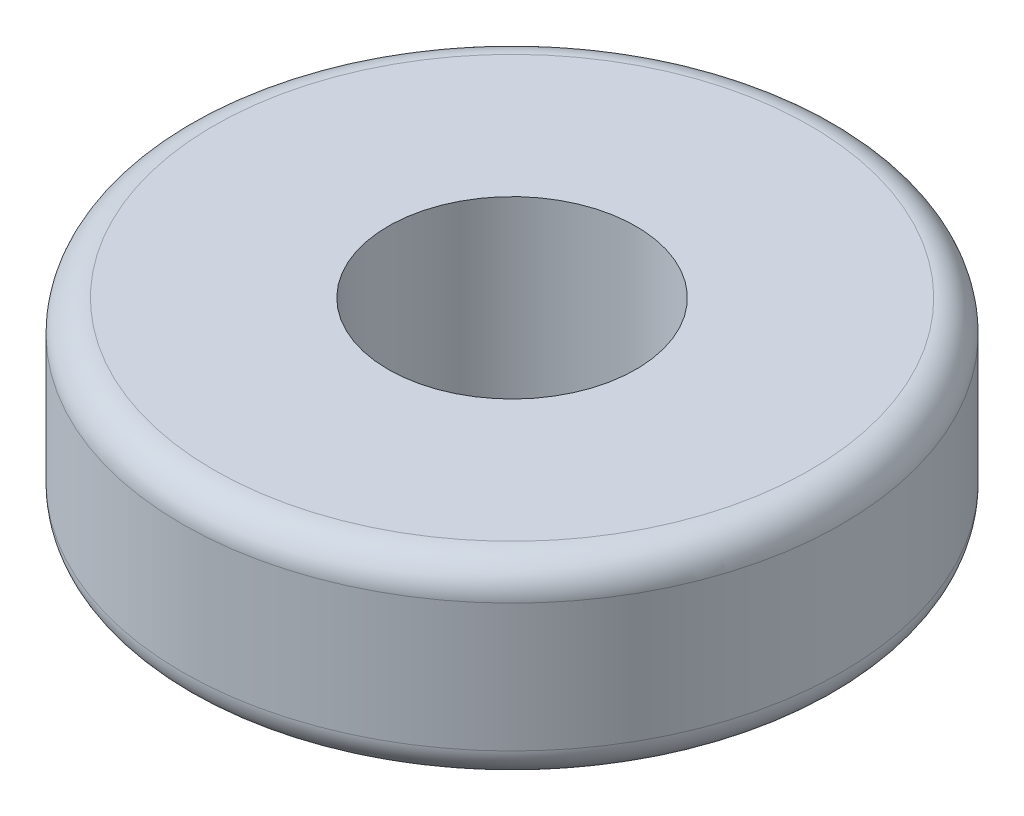
ISO-10303-21;
HEADER;
FILE_DESCRIPTION(('STEP AP214'),'2;1');
FILE_NAME('part.step','',(''),(''),'','','');
FILE_SCHEMA(('AUTOMOTIVE_DESIGN { 1 0 10303 214 1 1 1 1 }'));
ENDSEC;
DATA;
#1=APPLICATION_CONTEXT('core data for automotive mechanical design processes');
#2=APPLICATION_PROTOCOL_DEFINITION('international standard','automotive_design',2000,#1);
#3=PRODUCT_CONTEXT('',#1,'mechanical');
#4=PRODUCT('Part','Part','',(#3));
#5=PRODUCT_RELATED_PRODUCT_CATEGORY('part','',(#4));
#6=PRODUCT_DEFINITION_FORMATION('','',#4);
#7=PRODUCT_DEFINITION_CONTEXT('part definition',#1,'design');
#8=PRODUCT_DEFINITION('design','',#6,#7);
#9=PRODUCT_DEFINITION_SHAPE('','',#8);
#10=(LENGTH_UNIT() NAMED_UNIT(*) SI_UNIT(.MILLI.,.METRE.));
#11=(NAMED_UNIT(*) PLANE_ANGLE_UNIT() SI_UNIT($,.RADIAN.));
#12=(NAMED_UNIT(*) SI_UNIT($,.STERADIAN.) SOLID_ANGLE_UNIT());
#13=UNCERTAINTY_MEASURE_WITH_UNIT(LENGTH_MEASURE(1.E-05),#10,'distance_accuracy_value','');
#14=(GEOMETRIC_REPRESENTATION_CONTEXT(3) GLOBAL_UNCERTAINTY_ASSIGNED_CONTEXT((#13)) GLOBAL_UNIT_ASSIGNED_CONTEXT((#10,
#11,#12)) REPRESENTATION_CONTEXT('',''));
#15=CARTESIAN_POINT('',(0.,0.,0.));
#16=DIRECTION('',(0.,0.,1.));
#17=DIRECTION('',(1.,0.,0.));
#18=AXIS2_PLACEMENT_3D('',#15,#16,#17);
#19=CARTESIAN_POINT('',(0.,6.08,0.));
#20=DIRECTION('',(0.,1.,0.));
#21=DIRECTION('',(0.,0.,1.));
#22=AXIS2_PLACEMENT_3D('',#19,#20,#21);
#23=PLANE('',#22);
#24=CARTESIAN_POINT('',(0.,6.08,0.));
#25=DIRECTION('',(0.,1.,0.));
#26=DIRECTION('',(0.,0.,1.));
#27=AXIS2_PLACEMENT_3D('',#24,#25,#26);
#28=CIRCLE('',#27,9.5);
#29=CARTESIAN_POINT('',(0.,6.08,9.5));
#30=VERTEX_POINT('',#29);
#31=EDGE_CURVE('E10',#30,#30,#28,.T.);
#32=ORIENTED_EDGE('',*,*,#31,.T.);
#33=EDGE_LOOP('',(#32));
#34=FACE_BOUND('',#33,.T.);
#35=CARTESIAN_POINT('',(0.,6.08,0.));
#36=DIRECTION('',(0.,1.,0.));
#37=DIRECTION('',(0.,0.,1.));
#38=AXIS2_PLACEMENT_3D('',#35,#36,#37);
#39=CIRCLE('',#38,3.95);
#40=CARTESIAN_POINT('',(0.,6.08,3.95));
#41=VERTEX_POINT('',#40);
#42=EDGE_CURVE('E51',#41,#41,#39,.T.);
#43=ORIENTED_EDGE('',*,*,#42,.F.);
#44=EDGE_LOOP('',(#43));
#45=FACE_BOUND('',#44,.T.);
#46=ADVANCED_FACE('F31',(#34,#45),#23,.T.);
#47=CARTESIAN_POINT('',(0.,0.,0.));
#48=DIRECTION('',(0.,1.,0.));
#49=DIRECTION('',(0.,0.,1.));
#50=AXIS2_PLACEMENT_3D('',#47,#48,#49);
#51=PLANE('',#50);
#52=CARTESIAN_POINT('',(0.,0.,0.));
#53=DIRECTION('',(0.,1.,0.));
#54=DIRECTION('',(0.,0.,1.));
#55=AXIS2_PLACEMENT_3D('',#52,#53,#54);
#56=CIRCLE('',#55,9.5);
#57=CARTESIAN_POINT('',(0.,0.,9.5));
#58=VERTEX_POINT('',#57);
#59=EDGE_CURVE('E38',#58,#58,#56,.F.);
#60=ORIENTED_EDGE('',*,*,#59,.T.);
#61=EDGE_LOOP('',(#60));
#62=FACE_BOUND('',#61,.T.);
#63=CARTESIAN_POINT('',(0.,0.,0.));
#64=DIRECTION('',(0.,1.,0.));
#65=DIRECTION('',(0.,0.,1.));
#66=AXIS2_PLACEMENT_3D('',#63,#64,#65);
#67=CIRCLE('',#66,3.95);
#68=CARTESIAN_POINT('',(0.,0.,3.95));
#69=VERTEX_POINT('',#68);
#70=EDGE_CURVE('E52',#69,#69,#67,.T.);
#71=ORIENTED_EDGE('',*,*,#70,.T.);
#72=EDGE_LOOP('',(#71));
#73=FACE_BOUND('',#72,.T.);
#74=ADVANCED_FACE('F62',(#62,#73),#51,.F.);
#75=CARTESIAN_POINT('',(0.,6.08,0.));
#76=DIRECTION('',(0.,-1.,0.));
#77=DIRECTION('',(0.,0.,-1.));
#78=AXIS2_PLACEMENT_3D('',#75,#76,#77);
#79=CYLINDRICAL_SURFACE('',#78,10.5);
#80=CARTESIAN_POINT('',(0.,1.,0.));
#81=DIRECTION('',(0.,1.,0.));
#82=DIRECTION('',(0.,0.,1.));
#83=AXIS2_PLACEMENT_3D('',#80,#81,#82);
#84=CIRCLE('',#83,10.5);
#85=CARTESIAN_POINT('',(0.,1.,10.5));
#86=VERTEX_POINT('',#85);
#87=EDGE_CURVE('E42',#86,#86,#84,.T.);
#88=ORIENTED_EDGE('',*,*,#87,.T.);
#89=EDGE_LOOP('',(#88));
#90=FACE_BOUND('',#89,.T.);
#91=CARTESIAN_POINT('',(0.,5.08,0.));
#92=DIRECTION('',(0.,1.,0.));
#93=DIRECTION('',(0.,0.,1.));
#94=AXIS2_PLACEMENT_3D('',#91,#92,#93);
#95=CIRCLE('',#94,10.5);
#96=CARTESIAN_POINT('',(0.,5.08,10.5));
#97=VERTEX_POINT('',#96);
#98=EDGE_CURVE('E46',#97,#97,#95,.F.);
#99=ORIENTED_EDGE('',*,*,#98,.T.);
#100=EDGE_LOOP('',(#99));
#101=FACE_BOUND('',#100,.T.);
#102=ADVANCED_FACE('F67',(#90,#101),#79,.T.);
#103=CARTESIAN_POINT('',(0.,6.08,0.));
#104=DIRECTION('',(0.,-1.,0.));
#105=DIRECTION('',(0.,0.,-1.));
#106=AXIS2_PLACEMENT_3D('',#103,#104,#105);
#107=CYLINDRICAL_SURFACE('',#106,3.95);
#108=ORIENTED_EDGE('',*,*,#42,.T.);
#109=EDGE_LOOP('',(#108));
#110=FACE_BOUND('',#109,.T.);
#111=ORIENTED_EDGE('',*,*,#70,.F.);
#112=EDGE_LOOP('',(#111));
#113=FACE_BOUND('',#112,.T.);
#114=ADVANCED_FACE('F58',(#110,#113),#107,.F.);
#115=CARTESIAN_POINT('',(0.,1.,0.));
#116=DIRECTION('',(0.,1.,0.));
#117=DIRECTION('',(0.,0.,1.));
#118=AXIS2_PLACEMENT_3D('',#115,#116,#117);
#119=TOROIDAL_SURFACE('',#118,9.5,1.);
#120=ORIENTED_EDGE('',*,*,#59,.F.);
#121=EDGE_LOOP('',(#120));
#122=FACE_BOUND('',#121,.T.);
#123=ORIENTED_EDGE('',*,*,#87,.F.);
#124=EDGE_LOOP('',(#123));
#125=FACE_BOUND('',#124,.T.);
#126=ADVANCED_FACE('F73',(#122,#125),#119,.T.);
#127=CARTESIAN_POINT('',(0.,5.08,0.));
#128=DIRECTION('',(0.,1.,0.));
#129=DIRECTION('',(0.,0.,1.));
#130=AXIS2_PLACEMENT_3D('',#127,#128,#129);
#131=TOROIDAL_SURFACE('',#130,9.5,1.);
#132=ORIENTED_EDGE('',*,*,#98,.F.);
#133=EDGE_LOOP('',(#132));
#134=FACE_BOUND('',#133,.T.);
#135=ORIENTED_EDGE('',*,*,#31,.F.);
#136=EDGE_LOOP('',(#135));
#137=FACE_BOUND('',#136,.T.);
#138=ADVANCED_FACE('F33',(#134,#137),#131,.T.);
#139=CLOSED_SHELL('',(#46,#74,#102,#114,#126,#138));
#140=MANIFOLD_SOLID_BREP('B2',#139);
#141=ADVANCED_BREP_SHAPE_REPRESENTATION('',(#18,#140),#14);
#142=SHAPE_DEFINITION_REPRESENTATION(#9,#141);
ENDSEC;
END-ISO-10303-21;
